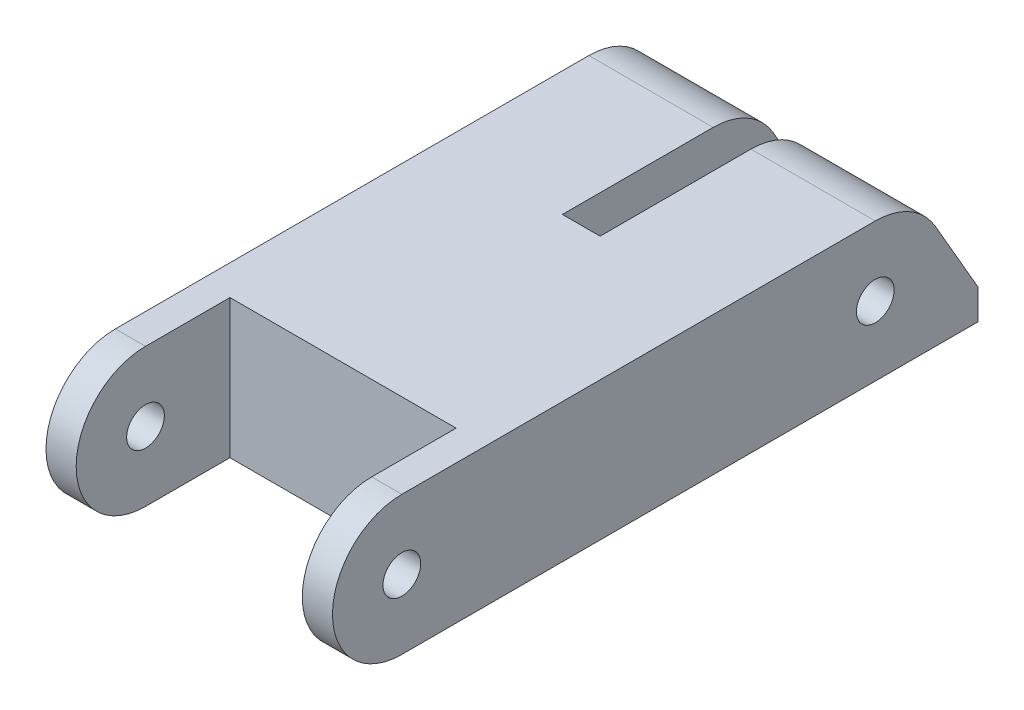
ISO-10303-21;
HEADER;
FILE_DESCRIPTION(('STEP AP214'),'2;1');
FILE_NAME('part.step','',(''),(''),'','','');
FILE_SCHEMA(('AUTOMOTIVE_DESIGN { 1 0 10303 214 1 1 1 1 }'));
ENDSEC;
DATA;
#1=APPLICATION_CONTEXT('core data for automotive mechanical design processes');
#2=APPLICATION_PROTOCOL_DEFINITION('international standard','automotive_design',2000,#1);
#3=PRODUCT_CONTEXT('',#1,'mechanical');
#4=PRODUCT('Part','Part','',(#3));
#5=PRODUCT_RELATED_PRODUCT_CATEGORY('part','',(#4));
#6=PRODUCT_DEFINITION_FORMATION('','',#4);
#7=PRODUCT_DEFINITION_CONTEXT('part definition',#1,'design');
#8=PRODUCT_DEFINITION('design','',#6,#7);
#9=PRODUCT_DEFINITION_SHAPE('','',#8);
#10=(LENGTH_UNIT() NAMED_UNIT(*) SI_UNIT(.MILLI.,.METRE.));
#11=(NAMED_UNIT(*) PLANE_ANGLE_UNIT() SI_UNIT($,.RADIAN.));
#12=(NAMED_UNIT(*) SI_UNIT($,.STERADIAN.) SOLID_ANGLE_UNIT());
#13=UNCERTAINTY_MEASURE_WITH_UNIT(LENGTH_MEASURE(1.E-05),#10,'distance_accuracy_value','');
#14=(GEOMETRIC_REPRESENTATION_CONTEXT(3) GLOBAL_UNCERTAINTY_ASSIGNED_CONTEXT((#13)) GLOBAL_UNIT_ASSIGNED_CONTEXT((#10,
#11,#12)) REPRESENTATION_CONTEXT('',''));
#15=CARTESIAN_POINT('',(0.,0.,0.));
#16=DIRECTION('',(0.,0.,1.));
#17=DIRECTION('',(1.,0.,0.));
#18=AXIS2_PLACEMENT_3D('',#15,#16,#17);
#19=CARTESIAN_POINT('',(6.0325,0.,-19.939));
#20=DIRECTION('',(-1.,0.,0.));
#21=DIRECTION('',(0.,0.,1.));
#22=AXIS2_PLACEMENT_3D('',#19,#20,#21);
#23=CYLINDRICAL_SURFACE('',#22,0.793749999999999);
#24=CARTESIAN_POINT('',(0.79375,0.,-19.939));
#25=DIRECTION('',(1.,0.,0.));
#26=DIRECTION('',(0.,0.,-1.));
#27=AXIS2_PLACEMENT_3D('',#24,#25,#26);
#28=CIRCLE('',#27,0.793749999999999);
#29=CARTESIAN_POINT('',(0.79375,0.,-19.14525));
#30=VERTEX_POINT('',#29);
#31=EDGE_CURVE('E516',#30,#30,#28,.T.);
#32=CARTESIAN_POINT('',(6.0325,0.,-19.939));
#33=DIRECTION('',(1.,0.,0.));
#34=DIRECTION('',(0.,0.,-1.));
#35=AXIS2_PLACEMENT_3D('',#32,#33,#34);
#36=CIRCLE('',#35,0.793749999999999);
#37=CARTESIAN_POINT('',(6.0325,0.,-19.14525));
#38=VERTEX_POINT('',#37);
#39=EDGE_CURVE('E572',#38,#38,#36,.T.);
#40=CARTESIAN_POINT('',(0.79375,0.,-19.14525));
#41=CARTESIAN_POINT('',(0.8483203125,0.,-19.14525));
#42=CARTESIAN_POINT('',(0.902890625,0.,-19.14525));
#43=CARTESIAN_POINT('',(1.01203125,0.,-19.14525));
#44=CARTESIAN_POINT('',(1.0666015625,0.,-19.14525));
#45=CARTESIAN_POINT('',(1.1757421875,0.,-19.14525));
#46=CARTESIAN_POINT('',(1.2303125,0.,-19.14525));
#47=CARTESIAN_POINT('',(1.339453125,0.,-19.14525));
#48=CARTESIAN_POINT('',(1.3940234375,0.,-19.14525));
#49=CARTESIAN_POINT('',(1.5031640625,0.,-19.14525));
#50=CARTESIAN_POINT('',(1.557734375,0.,-19.14525));
#51=CARTESIAN_POINT('',(1.666875,0.,-19.14525));
#52=CARTESIAN_POINT('',(1.7214453125,0.,-19.14525));
#53=CARTESIAN_POINT('',(1.8305859375,0.,-19.14525));
#54=CARTESIAN_POINT('',(1.88515625,0.,-19.14525));
#55=CARTESIAN_POINT('',(1.994296875,0.,-19.14525));
#56=CARTESIAN_POINT('',(2.0488671875,0.,-19.14525));
#57=CARTESIAN_POINT('',(2.1580078125,0.,-19.14525));
#58=CARTESIAN_POINT('',(2.212578125,0.,-19.14525));
#59=CARTESIAN_POINT('',(2.32171875,0.,-19.14525));
#60=CARTESIAN_POINT('',(2.3762890625,0.,-19.14525));
#61=CARTESIAN_POINT('',(2.4854296875,0.,-19.14525));
#62=CARTESIAN_POINT('',(2.54,0.,-19.14525));
#63=CARTESIAN_POINT('',(2.649140625,0.,-19.14525));
#64=CARTESIAN_POINT('',(2.7037109375,0.,-19.14525));
#65=CARTESIAN_POINT('',(2.8128515625,0.,-19.14525));
#66=CARTESIAN_POINT('',(2.867421875,0.,-19.14525));
#67=CARTESIAN_POINT('',(2.9765625,0.,-19.14525));
#68=CARTESIAN_POINT('',(3.0311328125,0.,-19.14525));
#69=CARTESIAN_POINT('',(3.1402734375,0.,-19.14525));
#70=CARTESIAN_POINT('',(3.19484375,0.,-19.14525));
#71=CARTESIAN_POINT('',(3.303984375,0.,-19.14525));
#72=CARTESIAN_POINT('',(3.3585546875,0.,-19.14525));
#73=CARTESIAN_POINT('',(3.4676953125,0.,-19.14525));
#74=CARTESIAN_POINT('',(3.522265625,0.,-19.14525));
#75=CARTESIAN_POINT('',(3.63140625,0.,-19.14525));
#76=CARTESIAN_POINT('',(3.6859765625,0.,-19.14525));
#77=CARTESIAN_POINT('',(3.7951171875,0.,-19.14525));
#78=CARTESIAN_POINT('',(3.8496875,0.,-19.14525));
#79=CARTESIAN_POINT('',(3.958828125,0.,-19.14525));
#80=CARTESIAN_POINT('',(4.0133984375,0.,-19.14525));
#81=CARTESIAN_POINT('',(4.1225390625,0.,-19.14525));
#82=CARTESIAN_POINT('',(4.177109375,0.,-19.14525));
#83=CARTESIAN_POINT('',(4.28625,0.,-19.14525));
#84=CARTESIAN_POINT('',(4.3408203125,0.,-19.14525));
#85=CARTESIAN_POINT('',(4.4499609375,0.,-19.14525));
#86=CARTESIAN_POINT('',(4.50453125,0.,-19.14525));
#87=CARTESIAN_POINT('',(4.613671875,0.,-19.14525));
#88=CARTESIAN_POINT('',(4.6682421875,0.,-19.14525));
#89=CARTESIAN_POINT('',(4.7773828125,0.,-19.14525));
#90=CARTESIAN_POINT('',(4.831953125,0.,-19.14525));
#91=CARTESIAN_POINT('',(4.94109375,0.,-19.14525));
#92=CARTESIAN_POINT('',(4.9956640625,0.,-19.14525));
#93=CARTESIAN_POINT('',(5.1048046875,0.,-19.14525));
#94=CARTESIAN_POINT('',(5.159375,0.,-19.14525));
#95=CARTESIAN_POINT('',(5.268515625,0.,-19.14525));
#96=CARTESIAN_POINT('',(5.3230859375,0.,-19.14525));
#97=CARTESIAN_POINT('',(5.4322265625,0.,-19.14525));
#98=CARTESIAN_POINT('',(5.486796875,0.,-19.14525));
#99=CARTESIAN_POINT('',(5.5959375,0.,-19.14525));
#100=CARTESIAN_POINT('',(5.6505078125,0.,-19.14525));
#101=CARTESIAN_POINT('',(5.7596484375,0.,-19.14525));
#102=CARTESIAN_POINT('',(5.81421875,0.,-19.14525));
#103=CARTESIAN_POINT('',(5.923359375,0.,-19.14525));
#104=CARTESIAN_POINT('',(5.9779296875,0.,-19.14525));
#105=CARTESIAN_POINT('',(6.0325,0.,-19.14525));
#106=B_SPLINE_CURVE_WITH_KNOTS('',3,(#40,#41,#42,#43,#44,#45,#46,#47,#48,#49,#50,#51,#52,#53,
#54,#55,#56,#57,#58,#59,#60,#61,#62,#63,#64,#65,#66,#67,#68,#69,#70,#71,#72,#73,#74,#75,#76,#77,
#78,#79,#80,#81,#82,#83,#84,#85,#86,#87,#88,#89,#90,#91,#92,#93,#94,#95,#96,#97,#98,#99,#100,
#101,#102,#103,#104,#105),.UNSPECIFIED.,.F.,.F.,(4,2,2,2,2,2,2,2,2,2,2,2,2,2,2,2,2,2,2,2,2,2,2,
2,2,2,2,2,2,2,2,2,4),(0.,0.1637109375,0.327421875,0.4911328125,0.65484375,0.8185546875,
0.982265625,1.1459765625,1.3096875,1.4733984375,1.637109375,1.8008203125,1.96453125,
2.1282421875,2.291953125,2.4556640625,2.619375,2.7830859375,2.946796875,3.1105078125,3.27421875,
3.4379296875,3.601640625,3.7653515625,3.9290625,4.0927734375,4.256484375,4.4201953125,
4.58390625,4.7476171875,4.911328125,5.0750390625,5.23875),.UNSPECIFIED.);
#107=EDGE_CURVE('BSEAM374',#30,#38,#106,.T.);
#108=ORIENTED_EDGE('',*,*,#31,.F.);
#109=ORIENTED_EDGE('',*,*,#39,.T.);
#110=ORIENTED_EDGE('',*,*,#107,.T.);
#111=ORIENTED_EDGE('',*,*,#107,.F.);
#112=EDGE_LOOP('',(#108,#110,#109,#111));
#113=FACE_BOUND('',#112,.T.);
#114=ADVANCED_FACE('F374',(#113),#23,.F.);
#115=CARTESIAN_POINT('',(6.0325,0.,-19.939));
#116=DIRECTION('',(-1.,0.,0.));
#117=DIRECTION('',(0.,0.,1.));
#118=AXIS2_PLACEMENT_3D('',#115,#116,#117);
#119=CYLINDRICAL_SURFACE('',#118,2.921);
#120=CARTESIAN_POINT('',(0.79375,0.,-19.939));
#121=DIRECTION('',(1.,0.,0.));
#122=DIRECTION('',(0.,0.,-1.));
#123=AXIS2_PLACEMENT_3D('',#120,#121,#122);
#124=CIRCLE('',#123,2.921);
#125=CARTESIAN_POINT('',(0.79375,2.921,-19.939));
#126=VERTEX_POINT('',#125);
#127=CARTESIAN_POINT('',(0.793749999999999,1.46050000000001,-22.4686602044543));
#128=VERTEX_POINT('',#127);
#129=EDGE_CURVE('E514',#126,#128,#124,.F.);
#130=ORIENTED_EDGE('',*,*,#129,.F.);
#131=DIRECTION('',(-1.,0.,0.));
#132=VECTOR('',#131,1.);
#133=CARTESIAN_POINT('',(6.0325,2.921,-19.939));
#134=LINE('',#133,#132);
#135=CARTESIAN_POINT('',(6.0325,2.921,-19.939));
#136=VERTEX_POINT('',#135);
#137=EDGE_CURVE('E607',#136,#126,#134,.T.);
#138=ORIENTED_EDGE('',*,*,#137,.F.);
#139=CARTESIAN_POINT('',(6.0325,0.,-19.939));
#140=DIRECTION('',(1.,0.,0.));
#141=DIRECTION('',(0.,0.,-1.));
#142=AXIS2_PLACEMENT_3D('',#139,#140,#141);
#143=CIRCLE('',#142,2.921);
#144=CARTESIAN_POINT('',(6.0325,1.46050000000001,-22.4686602044543));
#145=VERTEX_POINT('',#144);
#146=EDGE_CURVE('E612',#145,#136,#143,.T.);
#147=ORIENTED_EDGE('',*,*,#146,.F.);
#148=DIRECTION('',(1.,0.,0.));
#149=VECTOR('',#148,1.);
#150=CARTESIAN_POINT('',(-12.1898174827463,1.46050000000001,-22.4686602044543));
#151=LINE('',#150,#149);
#152=EDGE_CURVE('E535',#128,#145,#151,.T.);
#153=ORIENTED_EDGE('',*,*,#152,.F.);
#154=EDGE_LOOP('',(#130,#138,#147,#153));
#155=FACE_BOUND('',#154,.T.);
#156=ADVANCED_FACE('F662',(#155),#119,.T.);
#157=CARTESIAN_POINT('',(-12.1898174827463,1.46050000000001,-22.4686602044543));
#158=DIRECTION('',(0.,0.500000000000004,-0.866025403784436));
#159=DIRECTION('',(0.,0.866025403784436,0.500000000000004));
#160=AXIS2_PLACEMENT_3D('',#157,#158,#159);
#161=PLANE('',#160);
#162=DIRECTION('',(0.,-0.866025403784436,-0.500000000000004));
#163=VECTOR('',#162,1.);
#164=CARTESIAN_POINT('',(0.793749999999999,1.46050000000001,-22.4686602044543));
#165=LINE('',#164,#163);
#166=CARTESIAN_POINT('',(0.793749999999999,-1.651,-24.2650855670379));
#167=VERTEX_POINT('',#166);
#168=EDGE_CURVE('E12',#128,#167,#165,.T.);
#169=ORIENTED_EDGE('',*,*,#168,.F.);
#170=ORIENTED_EDGE('',*,*,#152,.T.);
#171=DIRECTION('',(0.,0.866025403784436,0.500000000000004));
#172=VECTOR('',#171,1.);
#173=CARTESIAN_POINT('',(6.0325,1.46050000000001,-22.4686602044543));
#174=LINE('',#173,#172);
#175=CARTESIAN_POINT('',(6.0325,-1.651,-24.2650855670379));
#176=VERTEX_POINT('',#175);
#177=EDGE_CURVE('E529',#176,#145,#174,.T.);
#178=ORIENTED_EDGE('',*,*,#177,.F.);
#179=DIRECTION('',(1.,0.,0.));
#180=VECTOR('',#179,1.);
#181=CARTESIAN_POINT('',(-12.1898174827463,-1.651,-24.2650855670379));
#182=LINE('',#181,#180);
#183=EDGE_CURVE('E539',#167,#176,#182,.T.);
#184=ORIENTED_EDGE('',*,*,#183,.F.);
#185=EDGE_LOOP('',(#169,#170,#178,#184));
#186=FACE_BOUND('',#185,.T.);
#187=ADVANCED_FACE('F669',(#186),#161,.T.);
#188=CARTESIAN_POINT('',(6.0325,0.,0.));
#189=DIRECTION('',(-1.,0.,0.));
#190=DIRECTION('',(0.,0.,1.));
#191=AXIS2_PLACEMENT_3D('',#188,#189,#190);
#192=CYLINDRICAL_SURFACE('',#191,2.921);
#193=DIRECTION('',(-1.,0.,0.));
#194=VECTOR('',#193,1.);
#195=CARTESIAN_POINT('',(6.0325,2.92099999999999,0.));
#196=LINE('',#195,#194);
#197=CARTESIAN_POINT('',(6.0325,2.92099999999999,0.));
#198=VERTEX_POINT('',#197);
#199=CARTESIAN_POINT('',(4.7625,2.92099999999999,0.));
#200=VERTEX_POINT('',#199);
#201=EDGE_CURVE('E596',#198,#200,#196,.T.);
#202=ORIENTED_EDGE('',*,*,#201,.T.);
#203=CARTESIAN_POINT('',(4.7625,0.,0.));
#204=DIRECTION('',(1.,0.,0.));
#205=DIRECTION('',(0.,0.,-1.));
#206=AXIS2_PLACEMENT_3D('',#203,#204,#205);
#207=CIRCLE('',#206,2.921);
#208=CARTESIAN_POINT('',(4.7625,-2.921,0.));
#209=VERTEX_POINT('',#208);
#210=EDGE_CURVE('E567',#200,#209,#207,.T.);
#211=ORIENTED_EDGE('',*,*,#210,.T.);
#212=DIRECTION('',(-1.,0.,0.));
#213=VECTOR('',#212,1.);
#214=CARTESIAN_POINT('',(6.0325,-2.921,0.));
#215=LINE('',#214,#213);
#216=CARTESIAN_POINT('',(6.0325,-2.921,0.));
#217=VERTEX_POINT('',#216);
#218=EDGE_CURVE('E600',#217,#209,#215,.T.);
#219=ORIENTED_EDGE('',*,*,#218,.F.);
#220=CARTESIAN_POINT('',(6.0325,0.,0.));
#221=DIRECTION('',(1.,0.,0.));
#222=DIRECTION('',(0.,0.,-1.));
#223=AXIS2_PLACEMENT_3D('',#220,#221,#222);
#224=CIRCLE('',#223,2.921);
#225=EDGE_CURVE('E588',#198,#217,#224,.T.);
#226=ORIENTED_EDGE('',*,*,#225,.F.);
#227=EDGE_LOOP('',(#202,#211,#219,#226));
#228=FACE_BOUND('',#227,.T.);
#229=ADVANCED_FACE('F653',(#228),#192,.T.);
#230=CARTESIAN_POINT('',(6.0325,0.,0.));
#231=DIRECTION('',(-1.,0.,0.));
#232=DIRECTION('',(0.,0.,1.));
#233=AXIS2_PLACEMENT_3D('',#230,#231,#232);
#234=CYLINDRICAL_SURFACE('',#233,0.79375);
#235=CARTESIAN_POINT('',(4.7625,0.,0.));
#236=DIRECTION('',(1.,0.,0.));
#237=DIRECTION('',(0.,0.,-1.));
#238=AXIS2_PLACEMENT_3D('',#235,#236,#237);
#239=CIRCLE('',#238,0.79375);
#240=CARTESIAN_POINT('',(4.7625,0.,0.79375));
#241=VERTEX_POINT('',#240);
#242=EDGE_CURVE('E566',#241,#241,#239,.T.);
#243=CARTESIAN_POINT('',(6.0325,0.,0.));
#244=DIRECTION('',(1.,0.,0.));
#245=DIRECTION('',(0.,0.,-1.));
#246=AXIS2_PLACEMENT_3D('',#243,#244,#245);
#247=CIRCLE('',#246,0.79375);
#248=CARTESIAN_POINT('',(6.0325,0.,0.79375));
#249=VERTEX_POINT('',#248);
#250=EDGE_CURVE('E578',#249,#249,#247,.T.);
#251=CARTESIAN_POINT('',(4.7625,0.,0.79375));
#252=CARTESIAN_POINT('',(4.77572916666667,0.,0.79375));
#253=CARTESIAN_POINT('',(4.78895833333333,0.,0.79375));
#254=CARTESIAN_POINT('',(4.81541666666667,0.,0.79375));
#255=CARTESIAN_POINT('',(4.82864583333333,0.,0.79375));
#256=CARTESIAN_POINT('',(4.85510416666667,0.,0.79375));
#257=CARTESIAN_POINT('',(4.86833333333333,0.,0.79375));
#258=CARTESIAN_POINT('',(4.89479166666667,0.,0.79375));
#259=CARTESIAN_POINT('',(4.90802083333333,0.,0.79375));
#260=CARTESIAN_POINT('',(4.93447916666667,0.,0.79375));
#261=CARTESIAN_POINT('',(4.94770833333333,0.,0.79375));
#262=CARTESIAN_POINT('',(4.97416666666667,0.,0.79375));
#263=CARTESIAN_POINT('',(4.98739583333333,0.,0.79375));
#264=CARTESIAN_POINT('',(5.01385416666667,0.,0.79375));
#265=CARTESIAN_POINT('',(5.02708333333333,0.,0.79375));
#266=CARTESIAN_POINT('',(5.05354166666667,0.,0.79375));
#267=CARTESIAN_POINT('',(5.06677083333333,0.,0.79375));
#268=CARTESIAN_POINT('',(5.09322916666667,0.,0.79375));
#269=CARTESIAN_POINT('',(5.10645833333333,0.,0.79375));
#270=CARTESIAN_POINT('',(5.13291666666667,0.,0.79375));
#271=CARTESIAN_POINT('',(5.14614583333333,0.,0.79375));
#272=CARTESIAN_POINT('',(5.17260416666667,0.,0.79375));
#273=CARTESIAN_POINT('',(5.18583333333333,0.,0.79375));
#274=CARTESIAN_POINT('',(5.21229166666667,0.,0.79375));
#275=CARTESIAN_POINT('',(5.22552083333333,0.,0.79375));
#276=CARTESIAN_POINT('',(5.25197916666667,0.,0.79375));
#277=CARTESIAN_POINT('',(5.26520833333333,0.,0.79375));
#278=CARTESIAN_POINT('',(5.29166666666667,0.,0.79375));
#279=CARTESIAN_POINT('',(5.30489583333333,0.,0.79375));
#280=CARTESIAN_POINT('',(5.33135416666667,0.,0.79375));
#281=CARTESIAN_POINT('',(5.34458333333333,0.,0.79375));
#282=CARTESIAN_POINT('',(5.37104166666667,0.,0.79375));
#283=CARTESIAN_POINT('',(5.38427083333333,0.,0.79375));
#284=CARTESIAN_POINT('',(5.41072916666667,0.,0.79375));
#285=CARTESIAN_POINT('',(5.42395833333333,0.,0.79375));
#286=CARTESIAN_POINT('',(5.45041666666667,0.,0.79375));
#287=CARTESIAN_POINT('',(5.46364583333333,0.,0.79375));
#288=CARTESIAN_POINT('',(5.49010416666667,0.,0.79375));
#289=CARTESIAN_POINT('',(5.50333333333333,0.,0.79375));
#290=CARTESIAN_POINT('',(5.52979166666667,0.,0.79375));
#291=CARTESIAN_POINT('',(5.54302083333333,0.,0.79375));
#292=CARTESIAN_POINT('',(5.56947916666667,0.,0.79375));
#293=CARTESIAN_POINT('',(5.58270833333333,0.,0.79375));
#294=CARTESIAN_POINT('',(5.60916666666667,0.,0.79375));
#295=CARTESIAN_POINT('',(5.62239583333333,0.,0.79375));
#296=CARTESIAN_POINT('',(5.64885416666667,0.,0.79375));
#297=CARTESIAN_POINT('',(5.66208333333333,0.,0.79375));
#298=CARTESIAN_POINT('',(5.68854166666667,0.,0.79375));
#299=CARTESIAN_POINT('',(5.70177083333333,0.,0.79375));
#300=CARTESIAN_POINT('',(5.72822916666667,0.,0.79375));
#301=CARTESIAN_POINT('',(5.74145833333333,0.,0.79375));
#302=CARTESIAN_POINT('',(5.76791666666667,0.,0.79375));
#303=CARTESIAN_POINT('',(5.78114583333333,0.,0.79375));
#304=CARTESIAN_POINT('',(5.80760416666667,0.,0.79375));
#305=CARTESIAN_POINT('',(5.82083333333333,0.,0.79375));
#306=CARTESIAN_POINT('',(5.84729166666667,0.,0.79375));
#307=CARTESIAN_POINT('',(5.86052083333333,0.,0.79375));
#308=CARTESIAN_POINT('',(5.88697916666667,0.,0.79375));
#309=CARTESIAN_POINT('',(5.90020833333333,0.,0.79375));
#310=CARTESIAN_POINT('',(5.92666666666667,0.,0.79375));
#311=CARTESIAN_POINT('',(5.93989583333333,0.,0.79375));
#312=CARTESIAN_POINT('',(5.96635416666667,0.,0.79375));
#313=CARTESIAN_POINT('',(5.97958333333333,0.,0.79375));
#314=CARTESIAN_POINT('',(6.00604166666667,0.,0.79375));
#315=CARTESIAN_POINT('',(6.01927083333333,0.,0.79375));
#316=CARTESIAN_POINT('',(6.0325,0.,0.79375));
#317=B_SPLINE_CURVE_WITH_KNOTS('',3,(#251,#252,#253,#254,#255,#256,#257,#258,#259,#260,#261,
#262,#263,#264,#265,#266,#267,#268,#269,#270,#271,#272,#273,#274,#275,#276,#277,#278,#279,#280,
#281,#282,#283,#284,#285,#286,#287,#288,#289,#290,#291,#292,#293,#294,#295,#296,#297,#298,#299,
#300,#301,#302,#303,#304,#305,#306,#307,#308,#309,#310,#311,#312,#313,#314,#315,#316),
.UNSPECIFIED.,.F.,.F.,(4,2,2,2,2,2,2,2,2,2,2,2,2,2,2,2,2,2,2,2,2,2,2,2,2,2,2,2,2,2,2,2,4),(0.,
0.0396874999999998,0.0793749999999996,0.1190625,0.15875,0.1984375,0.238125,0.277812499999999,
0.317499999999999,0.3571875,0.396875,0.436562499999999,0.476249999999999,0.5159375,0.555625,
0.595312499999999,0.634999999999999,0.674687499999999,0.714375,0.7540625,0.793749999999999,
0.833437499999999,0.873124999999999,0.9128125,0.952499999999999,0.992187499999999,1.031875,
1.0715625,1.11125,1.1509375,1.190625,1.2303125,1.27),.UNSPECIFIED.);
#318=EDGE_CURVE('BSEAM707',#241,#249,#317,.T.);
#319=ORIENTED_EDGE('',*,*,#242,.F.);
#320=ORIENTED_EDGE('',*,*,#250,.T.);
#321=ORIENTED_EDGE('',*,*,#318,.T.);
#322=ORIENTED_EDGE('',*,*,#318,.F.);
#323=EDGE_LOOP('',(#319,#321,#320,#322));
#324=FACE_BOUND('',#323,.T.);
#325=ADVANCED_FACE('F707',(#324),#234,.F.);
#326=CARTESIAN_POINT('',(6.0325,0.,0.));
#327=DIRECTION('',(1.,0.,0.));
#328=DIRECTION('',(0.,0.,-1.));
#329=AXIS2_PLACEMENT_3D('',#326,#327,#328);
#330=PLANE('',#329);
#331=ORIENTED_EDGE('',*,*,#250,.F.);
#332=EDGE_LOOP('',(#331));
#333=FACE_BOUND('',#332,.T.);
#334=DIRECTION('',(0.,0.,-1.));
#335=VECTOR('',#334,1.);
#336=CARTESIAN_POINT('',(6.0325,-2.921,0.));
#337=LINE('',#336,#335);
#338=CARTESIAN_POINT('',(6.0325,-2.921,-24.2650855670379));
#339=VERTEX_POINT('',#338);
#340=EDGE_CURVE('E591',#217,#339,#337,.T.);
#341=ORIENTED_EDGE('',*,*,#340,.T.);
#342=DIRECTION('',(0.,1.,0.));
#343=VECTOR('',#342,1.);
#344=CARTESIAN_POINT('',(6.0325,-1.651,-24.2650855670379));
#345=LINE('',#344,#343);
#346=EDGE_CURVE('E519',#339,#176,#345,.T.);
#347=ORIENTED_EDGE('',*,*,#346,.T.);
#348=ORIENTED_EDGE('',*,*,#177,.T.);
#349=ORIENTED_EDGE('',*,*,#146,.T.);
#350=DIRECTION('',(0.,0.,1.));
#351=VECTOR('',#350,1.);
#352=CARTESIAN_POINT('',(6.0325,2.92099999999999,0.));
#353=LINE('',#352,#351);
#354=EDGE_CURVE('E593',#136,#198,#353,.T.);
#355=ORIENTED_EDGE('',*,*,#354,.T.);
#356=ORIENTED_EDGE('',*,*,#225,.T.);
#357=EDGE_LOOP('',(#341,#347,#348,#349,#355,#356));
#358=FACE_BOUND('',#357,.T.);
#359=ORIENTED_EDGE('',*,*,#39,.F.);
#360=EDGE_LOOP('',(#359));
#361=FACE_BOUND('',#360,.T.);
#362=ADVANCED_FACE('F656',(#333,#358,#361),#330,.T.);
#363=CARTESIAN_POINT('',(-6.0325,0.,0.));
#364=DIRECTION('',(1.,0.,0.));
#365=DIRECTION('',(0.,0.,-1.));
#366=AXIS2_PLACEMENT_3D('',#363,#364,#365);
#367=PLANE('',#366);
#368=DIRECTION('',(0.,-1.,0.));
#369=VECTOR('',#368,1.);
#370=CARTESIAN_POINT('',(-6.0325,-1.651,-24.2650855670379));
#371=LINE('',#370,#369);
#372=CARTESIAN_POINT('',(-6.0325,-1.651,-24.2650855670379));
#373=VERTEX_POINT('',#372);
#374=CARTESIAN_POINT('',(-6.0325,-2.921,-24.2650855670379));
#375=VERTEX_POINT('',#374);
#376=EDGE_CURVE('E520',#373,#375,#371,.T.);
#377=ORIENTED_EDGE('',*,*,#376,.T.);
#378=DIRECTION('',(0.,0.,-1.));
#379=VECTOR('',#378,1.);
#380=CARTESIAN_POINT('',(-6.0325,-2.921,0.));
#381=LINE('',#380,#379);
#382=CARTESIAN_POINT('',(-6.0325,-2.921,0.));
#383=VERTEX_POINT('',#382);
#384=EDGE_CURVE('E584',#383,#375,#381,.T.);
#385=ORIENTED_EDGE('',*,*,#384,.F.);
#386=CARTESIAN_POINT('',(-6.0325,0.,0.));
#387=DIRECTION('',(1.,0.,0.));
#388=DIRECTION('',(0.,0.,-1.));
#389=AXIS2_PLACEMENT_3D('',#386,#387,#388);
#390=CIRCLE('',#389,2.921);
#391=CARTESIAN_POINT('',(-6.0325,2.92099999999999,0.));
#392=VERTEX_POINT('',#391);
#393=EDGE_CURVE('E581',#392,#383,#390,.T.);
#394=ORIENTED_EDGE('',*,*,#393,.F.);
#395=DIRECTION('',(0.,0.,1.));
#396=VECTOR('',#395,1.);
#397=CARTESIAN_POINT('',(-6.0325,2.92099999999999,0.));
#398=LINE('',#397,#396);
#399=CARTESIAN_POINT('',(-6.0325,2.921,-19.939));
#400=VERTEX_POINT('',#399);
#401=EDGE_CURVE('E586',#400,#392,#398,.T.);
#402=ORIENTED_EDGE('',*,*,#401,.F.);
#403=CARTESIAN_POINT('',(-6.0325,0.,-19.939));
#404=DIRECTION('',(1.,0.,0.));
#405=DIRECTION('',(0.,0.,-1.));
#406=AXIS2_PLACEMENT_3D('',#403,#404,#405);
#407=CIRCLE('',#406,2.921);
#408=CARTESIAN_POINT('',(-6.0325,1.46050000000001,-22.4686602044543));
#409=VERTEX_POINT('',#408);
#410=EDGE_CURVE('E609',#400,#409,#407,.F.);
#411=ORIENTED_EDGE('',*,*,#410,.T.);
#412=DIRECTION('',(0.,-0.866025403784436,-0.500000000000004));
#413=VECTOR('',#412,1.);
#414=CARTESIAN_POINT('',(-6.0325,1.46050000000001,-22.4686602044543));
#415=LINE('',#414,#413);
#416=EDGE_CURVE('E523',#409,#373,#415,.T.);
#417=ORIENTED_EDGE('',*,*,#416,.T.);
#418=EDGE_LOOP('',(#377,#385,#394,#402,#411,#417));
#419=FACE_BOUND('',#418,.T.);
#420=CARTESIAN_POINT('',(-6.0325,0.,0.));
#421=DIRECTION('',(1.,0.,0.));
#422=DIRECTION('',(0.,0.,-1.));
#423=AXIS2_PLACEMENT_3D('',#420,#421,#422);
#424=CIRCLE('',#423,0.79375);
#425=CARTESIAN_POINT('',(-6.0325,0.,0.79375));
#426=VERTEX_POINT('',#425);
#427=EDGE_CURVE('E575',#426,#426,#424,.T.);
#428=ORIENTED_EDGE('',*,*,#427,.T.);
#429=EDGE_LOOP('',(#428));
#430=FACE_BOUND('',#429,.T.);
#431=CARTESIAN_POINT('',(-6.0325,0.,-19.939));
#432=DIRECTION('',(1.,0.,0.));
#433=DIRECTION('',(0.,0.,-1.));
#434=AXIS2_PLACEMENT_3D('',#431,#432,#433);
#435=CIRCLE('',#434,0.793749999999999);
#436=CARTESIAN_POINT('',(-6.0325,0.,-19.14525));
#437=VERTEX_POINT('',#436);
#438=EDGE_CURVE('E569',#437,#437,#435,.T.);
#439=ORIENTED_EDGE('',*,*,#438,.T.);
#440=EDGE_LOOP('',(#439));
#441=FACE_BOUND('',#440,.T.);
#442=ADVANCED_FACE('F622',(#419,#430,#441),#367,.F.);
#443=CARTESIAN_POINT('',(-4.7625,0.,0.));
#444=DIRECTION('',(-1.,0.,0.));
#445=DIRECTION('',(0.,0.,1.));
#446=AXIS2_PLACEMENT_3D('',#443,#444,#445);
#447=CIRCLE('',#446,2.921);
#448=CARTESIAN_POINT('',(-4.7625,-2.921,0.));
#449=VERTEX_POINT('',#448);
#450=CARTESIAN_POINT('',(-4.7625,2.92099999999999,0.));
#451=VERTEX_POINT('',#450);
#452=EDGE_CURVE('E564',#449,#451,#447,.T.);
#453=ORIENTED_EDGE('',*,*,#452,.T.);
#454=EDGE_CURVE('E595',#451,#392,#196,.T.);
#455=ORIENTED_EDGE('',*,*,#454,.T.);
#456=ORIENTED_EDGE('',*,*,#393,.T.);
#457=EDGE_CURVE('E599',#449,#383,#215,.T.);
#458=ORIENTED_EDGE('',*,*,#457,.F.);
#459=EDGE_LOOP('',(#453,#455,#456,#458));
#460=FACE_BOUND('',#459,.T.);
#461=ADVANCED_FACE('F376',(#460),#192,.T.);
#462=CARTESIAN_POINT('',(6.0325,-2.921,0.));
#463=DIRECTION('',(0.,1.,0.));
#464=DIRECTION('',(0.,0.,1.));
#465=AXIS2_PLACEMENT_3D('',#462,#463,#464);
#466=PLANE('',#465);
#467=ORIENTED_EDGE('',*,*,#384,.T.);
#468=DIRECTION('',(1.,0.,0.));
#469=VECTOR('',#468,1.);
#470=CARTESIAN_POINT('',(-12.1898174827463,-2.921,-24.2650855670379));
#471=LINE('',#470,#469);
#472=EDGE_CURVE('E532',#375,#339,#471,.T.);
#473=ORIENTED_EDGE('',*,*,#472,.T.);
#474=ORIENTED_EDGE('',*,*,#340,.F.);
#475=ORIENTED_EDGE('',*,*,#218,.T.);
#476=DIRECTION('',(0.,0.,-1.));
#477=VECTOR('',#476,1.);
#478=CARTESIAN_POINT('',(4.7625,-2.921,-3.556));
#479=LINE('',#478,#477);
#480=CARTESIAN_POINT('',(4.7625,-2.921,-3.556));
#481=VERTEX_POINT('',#480);
#482=EDGE_CURVE('E550',#209,#481,#479,.T.);
#483=ORIENTED_EDGE('',*,*,#482,.T.);
#484=DIRECTION('',(-1.,0.,0.));
#485=VECTOR('',#484,1.);
#486=CARTESIAN_POINT('',(4.7625,-2.921,-3.556));
#487=LINE('',#486,#485);
#488=CARTESIAN_POINT('',(-4.7625,-2.921,-3.556));
#489=VERTEX_POINT('',#488);
#490=EDGE_CURVE('E553',#481,#489,#487,.T.);
#491=ORIENTED_EDGE('',*,*,#490,.T.);
#492=DIRECTION('',(0.,0.,1.));
#493=VECTOR('',#492,1.);
#494=CARTESIAN_POINT('',(-4.7625,-2.921,-3.556));
#495=LINE('',#494,#493);
#496=EDGE_CURVE('E556',#489,#449,#495,.T.);
#497=ORIENTED_EDGE('',*,*,#496,.T.);
#498=ORIENTED_EDGE('',*,*,#457,.T.);
#499=EDGE_LOOP('',(#467,#473,#474,#475,#483,#491,#497,#498));
#500=FACE_BOUND('',#499,.T.);
#501=ADVANCED_FACE('F631',(#500),#466,.F.);
#502=CARTESIAN_POINT('',(6.0325,2.92099999999999,0.));
#503=DIRECTION('',(0.,-1.,0.));
#504=DIRECTION('',(0.,0.,-1.));
#505=AXIS2_PLACEMENT_3D('',#502,#503,#504);
#506=PLANE('',#505);
#507=ORIENTED_EDGE('',*,*,#137,.T.);
#508=DIRECTION('',(0.,0.,-1.));
#509=VECTOR('',#508,1.);
#510=CARTESIAN_POINT('',(0.79375,2.921,-24.2650855670379));
#511=LINE('',#510,#509);
#512=CARTESIAN_POINT('',(0.79375,2.921,-13.589));
#513=VERTEX_POINT('',#512);
#514=EDGE_CURVE('E489',#513,#126,#511,.T.);
#515=ORIENTED_EDGE('',*,*,#514,.F.);
#516=DIRECTION('',(1.,0.,0.));
#517=VECTOR('',#516,1.);
#518=CARTESIAN_POINT('',(0.79375,2.921,-13.589));
#519=LINE('',#518,#517);
#520=CARTESIAN_POINT('',(-0.79375,2.921,-13.589));
#521=VERTEX_POINT('',#520);
#522=EDGE_CURVE('E488',#521,#513,#519,.T.);
#523=ORIENTED_EDGE('',*,*,#522,.F.);
#524=DIRECTION('',(0.,0.,1.));
#525=VECTOR('',#524,1.);
#526=CARTESIAN_POINT('',(-0.79375,2.921,-24.2650855670379));
#527=LINE('',#526,#525);
#528=CARTESIAN_POINT('',(-0.79375,2.921,-19.939));
#529=VERTEX_POINT('',#528);
#530=EDGE_CURVE('E481',#529,#521,#527,.T.);
#531=ORIENTED_EDGE('',*,*,#530,.F.);
#532=EDGE_CURVE('E396',#529,#400,#134,.T.);
#533=ORIENTED_EDGE('',*,*,#532,.T.);
#534=ORIENTED_EDGE('',*,*,#401,.T.);
#535=ORIENTED_EDGE('',*,*,#454,.F.);
#536=DIRECTION('',(0.,0.,1.));
#537=VECTOR('',#536,1.);
#538=CARTESIAN_POINT('',(-4.7625,2.92099999999999,-3.556));
#539=LINE('',#538,#537);
#540=CARTESIAN_POINT('',(-4.7625,2.92099999999999,-3.556));
#541=VERTEX_POINT('',#540);
#542=EDGE_CURVE('E547',#541,#451,#539,.T.);
#543=ORIENTED_EDGE('',*,*,#542,.F.);
#544=DIRECTION('',(-1.,0.,0.));
#545=VECTOR('',#544,1.);
#546=CARTESIAN_POINT('',(4.7625,2.92099999999999,-3.556));
#547=LINE('',#546,#545);
#548=CARTESIAN_POINT('',(4.7625,2.92099999999999,-3.556));
#549=VERTEX_POINT('',#548);
#550=EDGE_CURVE('E544',#549,#541,#547,.T.);
#551=ORIENTED_EDGE('',*,*,#550,.F.);
#552=DIRECTION('',(0.,0.,-1.));
#553=VECTOR('',#552,1.);
#554=CARTESIAN_POINT('',(4.7625,2.92099999999999,-3.556));
#555=LINE('',#554,#553);
#556=EDGE_CURVE('E526',#200,#549,#555,.T.);
#557=ORIENTED_EDGE('',*,*,#556,.F.);
#558=ORIENTED_EDGE('',*,*,#201,.F.);
#559=ORIENTED_EDGE('',*,*,#354,.F.);
#560=EDGE_LOOP('',(#507,#515,#523,#531,#533,#534,#535,#543,#551,#557,#558,#559));
#561=FACE_BOUND('',#560,.T.);
#562=ADVANCED_FACE('F501',(#561),#506,.F.);
#563=CARTESIAN_POINT('',(-4.7625,0.,0.));
#564=DIRECTION('',(-1.,0.,0.));
#565=DIRECTION('',(0.,0.,1.));
#566=AXIS2_PLACEMENT_3D('',#563,#564,#565);
#567=CIRCLE('',#566,0.79375);
#568=CARTESIAN_POINT('',(-4.7625,0.,0.79375));
#569=VERTEX_POINT('',#568);
#570=EDGE_CURVE('E562',#569,#569,#567,.T.);
#571=CARTESIAN_POINT('',(-4.7625,0.,0.79375));
#572=CARTESIAN_POINT('',(-4.77572916666666,0.,0.79375));
#573=CARTESIAN_POINT('',(-4.78895833333333,0.,0.79375));
#574=CARTESIAN_POINT('',(-4.81541666666666,0.,0.79375));
#575=CARTESIAN_POINT('',(-4.82864583333333,0.,0.79375));
#576=CARTESIAN_POINT('',(-4.85510416666666,0.,0.79375));
#577=CARTESIAN_POINT('',(-4.86833333333333,0.,0.79375));
#578=CARTESIAN_POINT('',(-4.89479166666667,0.,0.79375));
#579=CARTESIAN_POINT('',(-4.90802083333333,0.,0.79375));
#580=CARTESIAN_POINT('',(-4.93447916666666,0.,0.79375));
#581=CARTESIAN_POINT('',(-4.94770833333333,0.,0.79375));
#582=CARTESIAN_POINT('',(-4.97416666666667,0.,0.79375));
#583=CARTESIAN_POINT('',(-4.98739583333333,0.,0.79375));
#584=CARTESIAN_POINT('',(-5.01385416666666,0.,0.79375));
#585=CARTESIAN_POINT('',(-5.02708333333333,0.,0.79375));
#586=CARTESIAN_POINT('',(-5.05354166666667,0.,0.79375));
#587=CARTESIAN_POINT('',(-5.06677083333333,0.,0.79375));
#588=CARTESIAN_POINT('',(-5.09322916666667,0.,0.79375));
#589=CARTESIAN_POINT('',(-5.10645833333333,0.,0.79375));
#590=CARTESIAN_POINT('',(-5.13291666666667,0.,0.79375));
#591=CARTESIAN_POINT('',(-5.14614583333333,0.,0.79375));
#592=CARTESIAN_POINT('',(-5.17260416666667,0.,0.79375));
#593=CARTESIAN_POINT('',(-5.18583333333333,0.,0.79375));
#594=CARTESIAN_POINT('',(-5.21229166666667,0.,0.79375));
#595=CARTESIAN_POINT('',(-5.22552083333333,0.,0.79375));
#596=CARTESIAN_POINT('',(-5.25197916666666,0.,0.79375));
#597=CARTESIAN_POINT('',(-5.26520833333333,0.,0.79375));
#598=CARTESIAN_POINT('',(-5.29166666666667,0.,0.79375));
#599=CARTESIAN_POINT('',(-5.30489583333333,0.,0.79375));
#600=CARTESIAN_POINT('',(-5.33135416666667,0.,0.79375));
#601=CARTESIAN_POINT('',(-5.34458333333333,0.,0.79375));
#602=CARTESIAN_POINT('',(-5.37104166666667,0.,0.79375));
#603=CARTESIAN_POINT('',(-5.38427083333333,0.,0.79375));
#604=CARTESIAN_POINT('',(-5.41072916666667,0.,0.79375));
#605=CARTESIAN_POINT('',(-5.42395833333333,0.,0.79375));
#606=CARTESIAN_POINT('',(-5.45041666666667,0.,0.79375));
#607=CARTESIAN_POINT('',(-5.46364583333333,0.,0.79375));
#608=CARTESIAN_POINT('',(-5.49010416666667,0.,0.79375));
#609=CARTESIAN_POINT('',(-5.50333333333333,0.,0.79375));
#610=CARTESIAN_POINT('',(-5.52979166666667,0.,0.79375));
#611=CARTESIAN_POINT('',(-5.54302083333333,0.,0.79375));
#612=CARTESIAN_POINT('',(-5.56947916666667,0.,0.79375));
#613=CARTESIAN_POINT('',(-5.58270833333333,0.,0.79375));
#614=CARTESIAN_POINT('',(-5.60916666666667,0.,0.79375));
#615=CARTESIAN_POINT('',(-5.62239583333333,0.,0.79375));
#616=CARTESIAN_POINT('',(-5.64885416666667,0.,0.79375));
#617=CARTESIAN_POINT('',(-5.66208333333333,0.,0.79375));
#618=CARTESIAN_POINT('',(-5.68854166666667,0.,0.79375));
#619=CARTESIAN_POINT('',(-5.70177083333333,0.,0.79375));
#620=CARTESIAN_POINT('',(-5.72822916666667,0.,0.79375));
#621=CARTESIAN_POINT('',(-5.74145833333333,0.,0.79375));
#622=CARTESIAN_POINT('',(-5.76791666666667,0.,0.79375));
#623=CARTESIAN_POINT('',(-5.78114583333333,0.,0.79375));
#624=CARTESIAN_POINT('',(-5.80760416666667,0.,0.79375));
#625=CARTESIAN_POINT('',(-5.82083333333333,0.,0.79375));
#626=CARTESIAN_POINT('',(-5.84729166666667,0.,0.79375));
#627=CARTESIAN_POINT('',(-5.86052083333333,0.,0.79375));
#628=CARTESIAN_POINT('',(-5.88697916666667,0.,0.79375));
#629=CARTESIAN_POINT('',(-5.90020833333333,0.,0.79375));
#630=CARTESIAN_POINT('',(-5.92666666666667,0.,0.79375));
#631=CARTESIAN_POINT('',(-5.93989583333334,0.,0.79375));
#632=CARTESIAN_POINT('',(-5.96635416666667,0.,0.79375));
#633=CARTESIAN_POINT('',(-5.97958333333334,0.,0.79375));
#634=CARTESIAN_POINT('',(-6.00604166666667,0.,0.79375));
#635=CARTESIAN_POINT('',(-6.01927083333333,0.,0.79375));
#636=CARTESIAN_POINT('',(-6.0325,0.,0.79375));
#637=B_SPLINE_CURVE_WITH_KNOTS('',3,(#571,#572,#573,#574,#575,#576,#577,#578,#579,#580,#581,
#582,#583,#584,#585,#586,#587,#588,#589,#590,#591,#592,#593,#594,#595,#596,#597,#598,#599,#600,
#601,#602,#603,#604,#605,#606,#607,#608,#609,#610,#611,#612,#613,#614,#615,#616,#617,#618,#619,
#620,#621,#622,#623,#624,#625,#626,#627,#628,#629,#630,#631,#632,#633,#634,#635,#636),
.UNSPECIFIED.,.F.,.F.,(4,2,2,2,2,2,2,2,2,2,2,2,2,2,2,2,2,2,2,2,2,2,2,2,2,2,2,2,2,2,2,2,4),(0.,
0.0396874999999998,0.0793749999999996,0.119062500000001,0.158750000000001,0.198437500000001,
0.238125,0.2778125,0.317500000000002,0.357187500000002,0.396875000000001,0.436562500000001,
0.476250000000001,0.515937500000001,0.555625000000002,0.595312500000002,0.635000000000002,
0.674687500000002,0.714375000000001,0.754062500000003,0.793750000000003,0.833437500000003,
0.873125000000002,0.912812500000002,0.952500000000002,0.992187500000003,1.031875,1.0715625,
1.11125,1.1509375,1.190625,1.2303125,1.27),.UNSPECIFIED.);
#638=EDGE_CURVE('BSEAM697',#569,#426,#637,.T.);
#639=ORIENTED_EDGE('',*,*,#570,.F.);
#640=ORIENTED_EDGE('',*,*,#427,.F.);
#641=ORIENTED_EDGE('',*,*,#638,.T.);
#642=ORIENTED_EDGE('',*,*,#638,.F.);
#643=EDGE_LOOP('',(#639,#641,#640,#642));
#644=FACE_BOUND('',#643,.T.);
#645=ADVANCED_FACE('F697',(#644),#234,.F.);
#646=CARTESIAN_POINT('',(-0.79375,0.,-19.939));
#647=DIRECTION('',(-1.,0.,0.));
#648=DIRECTION('',(0.,0.,1.));
#649=AXIS2_PLACEMENT_3D('',#646,#647,#648);
#650=CIRCLE('',#649,0.793749999999999);
#651=CARTESIAN_POINT('',(-0.79375,0.,-19.14525));
#652=VERTEX_POINT('',#651);
#653=EDGE_CURVE('E511',#652,#652,#650,.T.);
#654=CARTESIAN_POINT('',(-0.79375,0.,-19.14525));
#655=CARTESIAN_POINT('',(-0.8483203125,0.,-19.14525));
#656=CARTESIAN_POINT('',(-0.902890625000001,0.,-19.14525));
#657=CARTESIAN_POINT('',(-1.01203125,0.,-19.14525));
#658=CARTESIAN_POINT('',(-1.0666015625,0.,-19.14525));
#659=CARTESIAN_POINT('',(-1.1757421875,0.,-19.14525));
#660=CARTESIAN_POINT('',(-1.2303125,0.,-19.14525));
#661=CARTESIAN_POINT('',(-1.339453125,0.,-19.14525));
#662=CARTESIAN_POINT('',(-1.3940234375,0.,-19.14525));
#663=CARTESIAN_POINT('',(-1.5031640625,0.,-19.14525));
#664=CARTESIAN_POINT('',(-1.557734375,0.,-19.14525));
#665=CARTESIAN_POINT('',(-1.666875,0.,-19.14525));
#666=CARTESIAN_POINT('',(-1.7214453125,0.,-19.14525));
#667=CARTESIAN_POINT('',(-1.8305859375,0.,-19.14525));
#668=CARTESIAN_POINT('',(-1.88515625,0.,-19.14525));
#669=CARTESIAN_POINT('',(-1.994296875,0.,-19.14525));
#670=CARTESIAN_POINT('',(-2.0488671875,0.,-19.14525));
#671=CARTESIAN_POINT('',(-2.1580078125,0.,-19.14525));
#672=CARTESIAN_POINT('',(-2.212578125,0.,-19.14525));
#673=CARTESIAN_POINT('',(-2.32171875,0.,-19.14525));
#674=CARTESIAN_POINT('',(-2.3762890625,0.,-19.14525));
#675=CARTESIAN_POINT('',(-2.4854296875,0.,-19.14525));
#676=CARTESIAN_POINT('',(-2.54,0.,-19.14525));
#677=CARTESIAN_POINT('',(-2.649140625,0.,-19.14525));
#678=CARTESIAN_POINT('',(-2.7037109375,0.,-19.14525));
#679=CARTESIAN_POINT('',(-2.8128515625,0.,-19.14525));
#680=CARTESIAN_POINT('',(-2.867421875,0.,-19.14525));
#681=CARTESIAN_POINT('',(-2.9765625,0.,-19.14525));
#682=CARTESIAN_POINT('',(-3.0311328125,0.,-19.14525));
#683=CARTESIAN_POINT('',(-3.1402734375,0.,-19.14525));
#684=CARTESIAN_POINT('',(-3.19484375,0.,-19.14525));
#685=CARTESIAN_POINT('',(-3.303984375,0.,-19.14525));
#686=CARTESIAN_POINT('',(-3.3585546875,0.,-19.14525));
#687=CARTESIAN_POINT('',(-3.4676953125,0.,-19.14525));
#688=CARTESIAN_POINT('',(-3.522265625,0.,-19.14525));
#689=CARTESIAN_POINT('',(-3.63140625,0.,-19.14525));
#690=CARTESIAN_POINT('',(-3.6859765625,0.,-19.14525));
#691=CARTESIAN_POINT('',(-3.7951171875,0.,-19.14525));
#692=CARTESIAN_POINT('',(-3.8496875,0.,-19.14525));
#693=CARTESIAN_POINT('',(-3.958828125,0.,-19.14525));
#694=CARTESIAN_POINT('',(-4.0133984375,0.,-19.14525));
#695=CARTESIAN_POINT('',(-4.1225390625,0.,-19.14525));
#696=CARTESIAN_POINT('',(-4.177109375,0.,-19.14525));
#697=CARTESIAN_POINT('',(-4.28625,0.,-19.14525));
#698=CARTESIAN_POINT('',(-4.3408203125,0.,-19.14525));
#699=CARTESIAN_POINT('',(-4.4499609375,0.,-19.14525));
#700=CARTESIAN_POINT('',(-4.50453125,0.,-19.14525));
#701=CARTESIAN_POINT('',(-4.613671875,0.,-19.14525));
#702=CARTESIAN_POINT('',(-4.6682421875,0.,-19.14525));
#703=CARTESIAN_POINT('',(-4.7773828125,0.,-19.14525));
#704=CARTESIAN_POINT('',(-4.831953125,0.,-19.14525));
#705=CARTESIAN_POINT('',(-4.94109375,0.,-19.14525));
#706=CARTESIAN_POINT('',(-4.9956640625,0.,-19.14525));
#707=CARTESIAN_POINT('',(-5.1048046875,0.,-19.14525));
#708=CARTESIAN_POINT('',(-5.159375,0.,-19.14525));
#709=CARTESIAN_POINT('',(-5.268515625,0.,-19.14525));
#710=CARTESIAN_POINT('',(-5.3230859375,0.,-19.14525));
#711=CARTESIAN_POINT('',(-5.4322265625,0.,-19.14525));
#712=CARTESIAN_POINT('',(-5.486796875,0.,-19.14525));
#713=CARTESIAN_POINT('',(-5.5959375,0.,-19.14525));
#714=CARTESIAN_POINT('',(-5.6505078125,0.,-19.14525));
#715=CARTESIAN_POINT('',(-5.7596484375,0.,-19.14525));
#716=CARTESIAN_POINT('',(-5.81421875,0.,-19.14525));
#717=CARTESIAN_POINT('',(-5.923359375,0.,-19.14525));
#718=CARTESIAN_POINT('',(-5.9779296875,0.,-19.14525));
#719=CARTESIAN_POINT('',(-6.0325,0.,-19.14525));
#720=B_SPLINE_CURVE_WITH_KNOTS('',3,(#654,#655,#656,#657,#658,#659,#660,#661,#662,#663,#664,
#665,#666,#667,#668,#669,#670,#671,#672,#673,#674,#675,#676,#677,#678,#679,#680,#681,#682,#683,
#684,#685,#686,#687,#688,#689,#690,#691,#692,#693,#694,#695,#696,#697,#698,#699,#700,#701,#702,
#703,#704,#705,#706,#707,#708,#709,#710,#711,#712,#713,#714,#715,#716,#717,#718,#719),
.UNSPECIFIED.,.F.,.F.,(4,2,2,2,2,2,2,2,2,2,2,2,2,2,2,2,2,2,2,2,2,2,2,2,2,2,2,2,2,2,2,2,4),(0.,
0.1637109375,0.327421875,0.4911328125,0.65484375,0.8185546875,0.982265625000001,1.1459765625,
1.3096875,1.4733984375,1.637109375,1.8008203125,1.96453125,2.1282421875,2.291953125,
2.4556640625,2.619375,2.7830859375,2.946796875,3.1105078125,3.27421875,3.4379296875,3.601640625,
3.7653515625,3.9290625,4.0927734375,4.256484375,4.4201953125,4.58390625,4.7476171875,
4.911328125,5.0750390625,5.23875),.UNSPECIFIED.);
#721=EDGE_CURVE('BSEAM686',#652,#437,#720,.T.);
#722=ORIENTED_EDGE('',*,*,#653,.F.);
#723=ORIENTED_EDGE('',*,*,#438,.F.);
#724=ORIENTED_EDGE('',*,*,#721,.T.);
#725=ORIENTED_EDGE('',*,*,#721,.F.);
#726=EDGE_LOOP('',(#722,#724,#723,#725));
#727=FACE_BOUND('',#726,.T.);
#728=ADVANCED_FACE('F686',(#727),#23,.F.);
#729=CARTESIAN_POINT('',(4.7625,-2.921,-3.556));
#730=DIRECTION('',(1.,0.,0.));
#731=DIRECTION('',(0.,0.,-1.));
#732=AXIS2_PLACEMENT_3D('',#729,#730,#731);
#733=PLANE('',#732);
#734=ORIENTED_EDGE('',*,*,#242,.T.);
#735=EDGE_LOOP('',(#734));
#736=FACE_BOUND('',#735,.T.);
#737=ORIENTED_EDGE('',*,*,#556,.T.);
#738=DIRECTION('',(0.,1.,0.));
#739=VECTOR('',#738,1.);
#740=CARTESIAN_POINT('',(4.7625,-2.921,-3.556));
#741=LINE('',#740,#739);
#742=EDGE_CURVE('E559',#481,#549,#741,.T.);
#743=ORIENTED_EDGE('',*,*,#742,.F.);
#744=ORIENTED_EDGE('',*,*,#482,.F.);
#745=ORIENTED_EDGE('',*,*,#210,.F.);
#746=EDGE_LOOP('',(#737,#743,#744,#745));
#747=FACE_BOUND('',#746,.T.);
#748=ADVANCED_FACE('F648',(#736,#747),#733,.F.);
#749=CARTESIAN_POINT('',(-4.7625,-2.921,-3.556));
#750=DIRECTION('',(-1.,0.,0.));
#751=DIRECTION('',(0.,0.,1.));
#752=AXIS2_PLACEMENT_3D('',#749,#750,#751);
#753=PLANE('',#752);
#754=ORIENTED_EDGE('',*,*,#570,.T.);
#755=EDGE_LOOP('',(#754));
#756=FACE_BOUND('',#755,.T.);
#757=ORIENTED_EDGE('',*,*,#452,.F.);
#758=ORIENTED_EDGE('',*,*,#496,.F.);
#759=DIRECTION('',(0.,1.,0.));
#760=VECTOR('',#759,1.);
#761=CARTESIAN_POINT('',(-4.7625,-2.921,-3.556));
#762=LINE('',#761,#760);
#763=EDGE_CURVE('E560',#489,#541,#762,.T.);
#764=ORIENTED_EDGE('',*,*,#763,.T.);
#765=ORIENTED_EDGE('',*,*,#542,.T.);
#766=EDGE_LOOP('',(#757,#758,#764,#765));
#767=FACE_BOUND('',#766,.T.);
#768=ADVANCED_FACE('F641',(#756,#767),#753,.F.);
#769=CARTESIAN_POINT('',(4.7625,-2.921,-3.556));
#770=DIRECTION('',(0.,0.,-1.));
#771=DIRECTION('',(0.,1.,0.));
#772=AXIS2_PLACEMENT_3D('',#769,#770,#771);
#773=PLANE('',#772);
#774=ORIENTED_EDGE('',*,*,#550,.T.);
#775=ORIENTED_EDGE('',*,*,#763,.F.);
#776=ORIENTED_EDGE('',*,*,#490,.F.);
#777=ORIENTED_EDGE('',*,*,#742,.T.);
#778=EDGE_LOOP('',(#774,#775,#776,#777));
#779=FACE_BOUND('',#778,.T.);
#780=ADVANCED_FACE('F645',(#779),#773,.F.);
#781=CARTESIAN_POINT('',(-0.79375,0.,-19.939));
#782=DIRECTION('',(-1.,0.,0.));
#783=DIRECTION('',(0.,0.,1.));
#784=AXIS2_PLACEMENT_3D('',#781,#782,#783);
#785=CIRCLE('',#784,2.921);
#786=CARTESIAN_POINT('',(-0.793749999999999,1.46050000000001,-22.4686602044543));
#787=VERTEX_POINT('',#786);
#788=EDGE_CURVE('E486',#787,#529,#785,.F.);
#789=ORIENTED_EDGE('',*,*,#788,.F.);
#790=EDGE_CURVE('E524',#409,#787,#151,.T.);
#791=ORIENTED_EDGE('',*,*,#790,.F.);
#792=ORIENTED_EDGE('',*,*,#410,.F.);
#793=ORIENTED_EDGE('',*,*,#532,.F.);
#794=EDGE_LOOP('',(#789,#791,#792,#793));
#795=FACE_BOUND('',#794,.T.);
#796=ADVANCED_FACE('F618',(#795),#119,.T.);
#797=DIRECTION('',(0.,0.866025403784436,0.500000000000004));
#798=VECTOR('',#797,1.);
#799=CARTESIAN_POINT('',(-0.793749999999999,1.46050000000001,-22.4686602044543));
#800=LINE('',#799,#798);
#801=CARTESIAN_POINT('',(-0.79375,-1.651,-24.2650855670379));
#802=VERTEX_POINT('',#801);
#803=EDGE_CURVE('E382',#802,#787,#800,.T.);
#804=ORIENTED_EDGE('',*,*,#803,.F.);
#805=EDGE_CURVE('E536',#373,#802,#182,.T.);
#806=ORIENTED_EDGE('',*,*,#805,.F.);
#807=ORIENTED_EDGE('',*,*,#416,.F.);
#808=ORIENTED_EDGE('',*,*,#790,.T.);
#809=EDGE_LOOP('',(#804,#806,#807,#808));
#810=FACE_BOUND('',#809,.T.);
#811=ADVANCED_FACE('F619',(#810),#161,.T.);
#812=CARTESIAN_POINT('',(-12.1898174827463,-1.651,-24.2650855670379));
#813=DIRECTION('',(0.,0.,-1.));
#814=DIRECTION('',(-1.,0.,0.));
#815=AXIS2_PLACEMENT_3D('',#812,#813,#814);
#816=PLANE('',#815);
#817=ORIENTED_EDGE('',*,*,#376,.F.);
#818=ORIENTED_EDGE('',*,*,#805,.T.);
#819=DIRECTION('',(1.,0.,0.));
#820=VECTOR('',#819,1.);
#821=CARTESIAN_POINT('',(0.79375,-1.651,-24.2650855670379));
#822=LINE('',#821,#820);
#823=EDGE_CURVE('E507',#802,#167,#822,.T.);
#824=ORIENTED_EDGE('',*,*,#823,.T.);
#825=ORIENTED_EDGE('',*,*,#183,.T.);
#826=ORIENTED_EDGE('',*,*,#346,.F.);
#827=ORIENTED_EDGE('',*,*,#472,.F.);
#828=EDGE_LOOP('',(#817,#818,#824,#825,#826,#827));
#829=FACE_BOUND('',#828,.T.);
#830=ADVANCED_FACE('F628',(#829),#816,.T.);
#831=CARTESIAN_POINT('',(0.79375,-13.7144683621492,-24.2650855670379));
#832=DIRECTION('',(1.,0.,0.));
#833=DIRECTION('',(0.,0.,-1.));
#834=AXIS2_PLACEMENT_3D('',#831,#832,#833);
#835=PLANE('',#834);
#836=ORIENTED_EDGE('',*,*,#31,.T.);
#837=EDGE_LOOP('',(#836));
#838=FACE_BOUND('',#837,.T.);
#839=ORIENTED_EDGE('',*,*,#129,.T.);
#840=ORIENTED_EDGE('',*,*,#168,.T.);
#841=DIRECTION('',(0.,0.,1.));
#842=VECTOR('',#841,1.);
#843=CARTESIAN_POINT('',(0.79375,-1.651,-24.2650855670379));
#844=LINE('',#843,#842);
#845=CARTESIAN_POINT('',(0.79375,-1.651,-13.589));
#846=VERTEX_POINT('',#845);
#847=EDGE_CURVE('E389',#167,#846,#844,.T.);
#848=ORIENTED_EDGE('',*,*,#847,.T.);
#849=DIRECTION('',(0.,1.,0.));
#850=VECTOR('',#849,1.);
#851=CARTESIAN_POINT('',(0.79375,-13.7144683621492,-13.589));
#852=LINE('',#851,#850);
#853=EDGE_CURVE('E498',#846,#513,#852,.T.);
#854=ORIENTED_EDGE('',*,*,#853,.T.);
#855=ORIENTED_EDGE('',*,*,#514,.T.);
#856=EDGE_LOOP('',(#839,#840,#848,#854,#855));
#857=FACE_BOUND('',#856,.T.);
#858=ADVANCED_FACE('F666',(#838,#857),#835,.F.);
#859=CARTESIAN_POINT('',(0.79375,-13.7144683621492,-13.589));
#860=DIRECTION('',(0.,0.,1.));
#861=DIRECTION('',(0.,-1.,0.));
#862=AXIS2_PLACEMENT_3D('',#859,#860,#861);
#863=PLANE('',#862);
#864=DIRECTION('',(-1.,0.,0.));
#865=VECTOR('',#864,1.);
#866=CARTESIAN_POINT('',(0.79375,-1.651,-13.589));
#867=LINE('',#866,#865);
#868=CARTESIAN_POINT('',(-0.79375,-1.651,-13.589));
#869=VERTEX_POINT('',#868);
#870=EDGE_CURVE('E496',#846,#869,#867,.T.);
#871=ORIENTED_EDGE('',*,*,#870,.T.);
#872=DIRECTION('',(0.,1.,0.));
#873=VECTOR('',#872,1.);
#874=CARTESIAN_POINT('',(-0.79375,-13.7144683621492,-13.589));
#875=LINE('',#874,#873);
#876=EDGE_CURVE('E484',#869,#521,#875,.T.);
#877=ORIENTED_EDGE('',*,*,#876,.T.);
#878=ORIENTED_EDGE('',*,*,#522,.T.);
#879=ORIENTED_EDGE('',*,*,#853,.F.);
#880=EDGE_LOOP('',(#871,#877,#878,#879));
#881=FACE_BOUND('',#880,.T.);
#882=ADVANCED_FACE('F493',(#881),#863,.F.);
#883=CARTESIAN_POINT('',(-0.79375,-13.7144683621492,-24.2650855670379));
#884=DIRECTION('',(-1.,0.,0.));
#885=DIRECTION('',(0.,0.,1.));
#886=AXIS2_PLACEMENT_3D('',#883,#884,#885);
#887=PLANE('',#886);
#888=ORIENTED_EDGE('',*,*,#653,.T.);
#889=EDGE_LOOP('',(#888));
#890=FACE_BOUND('',#889,.T.);
#891=ORIENTED_EDGE('',*,*,#788,.T.);
#892=ORIENTED_EDGE('',*,*,#530,.T.);
#893=ORIENTED_EDGE('',*,*,#876,.F.);
#894=DIRECTION('',(0.,0.,-1.));
#895=VECTOR('',#894,1.);
#896=CARTESIAN_POINT('',(-0.79375,-1.651,-24.2650855670379));
#897=LINE('',#896,#895);
#898=EDGE_CURVE('E505',#869,#802,#897,.T.);
#899=ORIENTED_EDGE('',*,*,#898,.T.);
#900=ORIENTED_EDGE('',*,*,#803,.T.);
#901=EDGE_LOOP('',(#891,#892,#893,#899,#900));
#902=FACE_BOUND('',#901,.T.);
#903=ADVANCED_FACE('F483',(#890,#902),#887,.F.);
#904=CARTESIAN_POINT('',(6.0325,-1.651,0.));
#905=DIRECTION('',(0.,1.,0.));
#906=DIRECTION('',(0.,0.,1.));
#907=AXIS2_PLACEMENT_3D('',#904,#905,#906);
#908=PLANE('',#907);
#909=ORIENTED_EDGE('',*,*,#847,.F.);
#910=ORIENTED_EDGE('',*,*,#823,.F.);
#911=ORIENTED_EDGE('',*,*,#898,.F.);
#912=ORIENTED_EDGE('',*,*,#870,.F.);
#913=EDGE_LOOP('',(#909,#910,#911,#912));
#914=FACE_BOUND('',#913,.T.);
#915=ADVANCED_FACE('F671',(#914),#908,.T.);
#916=CLOSED_SHELL('',(#114,#156,#187,#229,#325,#362,#442,#461,#501,#562,#645,#728,#748,#768,
#780,#796,#811,#830,#858,#882,#903,#915));
#917=MANIFOLD_SOLID_BREP('B2',#916);
#918=ADVANCED_BREP_SHAPE_REPRESENTATION('',(#18,#917),#14);
#919=SHAPE_DEFINITION_REPRESENTATION(#9,#918);
ENDSEC;
END-ISO-10303-21;
